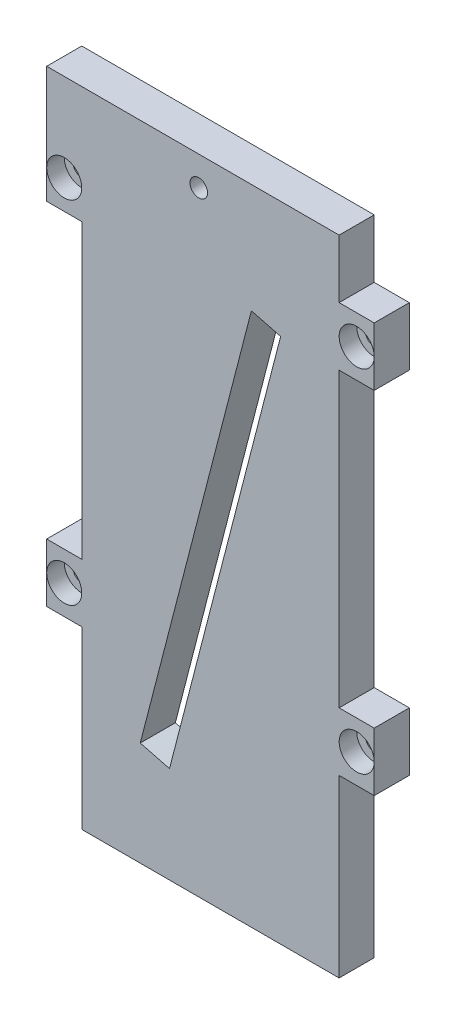
ISO-10303-21;
HEADER;
FILE_DESCRIPTION(('STEP AP214'),'2;1');
FILE_NAME('part.step','',(''),(''),'','','');
FILE_SCHEMA(('AUTOMOTIVE_DESIGN { 1 0 10303 214 1 1 1 1 }'));
ENDSEC;
DATA;
#1=APPLICATION_CONTEXT('core data for automotive mechanical design processes');
#2=APPLICATION_PROTOCOL_DEFINITION('international standard','automotive_design',2000,#1);
#3=PRODUCT_CONTEXT('',#1,'mechanical');
#4=PRODUCT('Part','Part','',(#3));
#5=PRODUCT_RELATED_PRODUCT_CATEGORY('part','',(#4));
#6=PRODUCT_DEFINITION_FORMATION('','',#4);
#7=PRODUCT_DEFINITION_CONTEXT('part definition',#1,'design');
#8=PRODUCT_DEFINITION('design','',#6,#7);
#9=PRODUCT_DEFINITION_SHAPE('','',#8);
#10=(LENGTH_UNIT() NAMED_UNIT(*) SI_UNIT(.MILLI.,.METRE.));
#11=(NAMED_UNIT(*) PLANE_ANGLE_UNIT() SI_UNIT($,.RADIAN.));
#12=(NAMED_UNIT(*) SI_UNIT($,.STERADIAN.) SOLID_ANGLE_UNIT());
#13=UNCERTAINTY_MEASURE_WITH_UNIT(LENGTH_MEASURE(1.E-05),#10,'distance_accuracy_value','');
#14=(GEOMETRIC_REPRESENTATION_CONTEXT(3) GLOBAL_UNCERTAINTY_ASSIGNED_CONTEXT((#13)) GLOBAL_UNIT_ASSIGNED_CONTEXT((#10,
#11,#12)) REPRESENTATION_CONTEXT('',''));
#15=CARTESIAN_POINT('',(0.,0.,0.));
#16=DIRECTION('',(0.,0.,1.));
#17=DIRECTION('',(1.,0.,0.));
#18=AXIS2_PLACEMENT_3D('',#15,#16,#17);
#19=CARTESIAN_POINT('',(-3.,75.,0.));
#20=DIRECTION('',(0.,0.,1.));
#21=DIRECTION('',(1.,0.,0.));
#22=AXIS2_PLACEMENT_3D('',#19,#20,#21);
#23=CYLINDRICAL_SURFACE('',#22,1.5);
#24=CARTESIAN_POINT('',(-3.,75.,0.));
#25=DIRECTION('',(0.,0.,1.));
#26=DIRECTION('',(1.,0.,0.));
#27=AXIS2_PLACEMENT_3D('',#24,#25,#26);
#28=CIRCLE('',#27,1.5);
#29=CARTESIAN_POINT('',(-1.5,75.,0.));
#30=VERTEX_POINT('',#29);
#31=EDGE_CURVE('E321',#30,#30,#28,.T.);
#32=ORIENTED_EDGE('',*,*,#31,.F.);
#33=EDGE_LOOP('',(#32));
#34=FACE_BOUND('',#33,.T.);
#35=CARTESIAN_POINT('',(-3.,75.,3.));
#36=DIRECTION('',(0.,0.,1.));
#37=DIRECTION('',(1.,0.,0.));
#38=AXIS2_PLACEMENT_3D('',#35,#36,#37);
#39=CIRCLE('',#38,1.5);
#40=CARTESIAN_POINT('',(-1.5,75.,3.));
#41=VERTEX_POINT('',#40);
#42=EDGE_CURVE('E301',#41,#41,#39,.F.);
#43=ORIENTED_EDGE('',*,*,#42,.F.);
#44=EDGE_LOOP('',(#43));
#45=FACE_BOUND('',#44,.T.);
#46=ADVANCED_FACE('F33',(#34,#45),#23,.F.);
#47=CARTESIAN_POINT('',(-3.,15.,0.));
#48=DIRECTION('',(0.,0.,1.));
#49=DIRECTION('',(1.,0.,0.));
#50=AXIS2_PLACEMENT_3D('',#47,#48,#49);
#51=CYLINDRICAL_SURFACE('',#50,1.5);
#52=CARTESIAN_POINT('',(-3.,15.,0.));
#53=DIRECTION('',(0.,0.,1.));
#54=DIRECTION('',(1.,0.,0.));
#55=AXIS2_PLACEMENT_3D('',#52,#53,#54);
#56=CIRCLE('',#55,1.5);
#57=CARTESIAN_POINT('',(-1.5,15.,0.));
#58=VERTEX_POINT('',#57);
#59=EDGE_CURVE('E318',#58,#58,#56,.T.);
#60=ORIENTED_EDGE('',*,*,#59,.F.);
#61=EDGE_LOOP('',(#60));
#62=FACE_BOUND('',#61,.T.);
#63=CARTESIAN_POINT('',(-3.,15.,3.));
#64=DIRECTION('',(0.,0.,1.));
#65=DIRECTION('',(1.,0.,0.));
#66=AXIS2_PLACEMENT_3D('',#63,#64,#65);
#67=CIRCLE('',#66,1.5);
#68=CARTESIAN_POINT('',(-1.5,15.,3.));
#69=VERTEX_POINT('',#68);
#70=EDGE_CURVE('E308',#69,#69,#67,.F.);
#71=ORIENTED_EDGE('',*,*,#70,.F.);
#72=EDGE_LOOP('',(#71));
#73=FACE_BOUND('',#72,.T.);
#74=ADVANCED_FACE('F471',(#62,#73),#51,.F.);
#75=CARTESIAN_POINT('',(0.,0.,6.));
#76=DIRECTION('',(1.,0.,0.));
#77=DIRECTION('',(0.,0.,-1.));
#78=AXIS2_PLACEMENT_3D('',#75,#76,#77);
#79=PLANE('',#78);
#80=DIRECTION('',(0.,1.,0.));
#81=VECTOR('',#80,1.);
#82=CARTESIAN_POINT('',(0.,-13.,4.));
#83=LINE('',#82,#81);
#84=CARTESIAN_POINT('',(0.,-13.,4.));
#85=VERTEX_POINT('',#84);
#86=CARTESIAN_POINT('',(0.,-6.50000000000001,4.));
#87=VERTEX_POINT('',#86);
#88=EDGE_CURVE('E245',#85,#87,#83,.T.);
#89=ORIENTED_EDGE('',*,*,#88,.F.);
#90=DIRECTION('',(0.,0.,-1.));
#91=VECTOR('',#90,1.);
#92=CARTESIAN_POINT('',(0.,-13.,4.));
#93=LINE('',#92,#91);
#94=CARTESIAN_POINT('',(0.,-13.,0.));
#95=VERTEX_POINT('',#94);
#96=EDGE_CURVE('E265',#85,#95,#93,.T.);
#97=ORIENTED_EDGE('',*,*,#96,.T.);
#98=DIRECTION('',(0.,-1.,0.));
#99=VECTOR('',#98,1.);
#100=CARTESIAN_POINT('',(0.,0.,0.));
#101=LINE('',#100,#99);
#102=CARTESIAN_POINT('',(0.,-20.,0.));
#103=VERTEX_POINT('',#102);
#104=EDGE_CURVE('E328',#95,#103,#101,.T.);
#105=ORIENTED_EDGE('',*,*,#104,.T.);
#106=DIRECTION('',(0.,0.,-1.));
#107=VECTOR('',#106,1.);
#108=CARTESIAN_POINT('',(0.,-20.,6.));
#109=LINE('',#108,#107);
#110=CARTESIAN_POINT('',(0.,-20.,6.));
#111=VERTEX_POINT('',#110);
#112=EDGE_CURVE('E280',#111,#103,#109,.T.);
#113=ORIENTED_EDGE('',*,*,#112,.F.);
#114=DIRECTION('',(0.,-1.,0.));
#115=VECTOR('',#114,1.);
#116=CARTESIAN_POINT('',(0.,0.,6.));
#117=LINE('',#116,#115);
#118=CARTESIAN_POINT('',(0.,9.99999999999999,6.));
#119=VERTEX_POINT('',#118);
#120=EDGE_CURVE('E331',#119,#111,#117,.T.);
#121=ORIENTED_EDGE('',*,*,#120,.F.);
#122=DIRECTION('',(0.,0.,-1.));
#123=VECTOR('',#122,1.);
#124=CARTESIAN_POINT('',(0.,9.99999999999999,6.));
#125=LINE('',#124,#123);
#126=CARTESIAN_POINT('',(0.,9.99999999999999,0.));
#127=VERTEX_POINT('',#126);
#128=EDGE_CURVE('E366',#119,#127,#125,.T.);
#129=ORIENTED_EDGE('',*,*,#128,.T.);
#130=CARTESIAN_POINT('',(0.,-6.50000000000001,0.));
#131=VERTEX_POINT('',#130);
#132=EDGE_CURVE('E367',#127,#131,#101,.T.);
#133=ORIENTED_EDGE('',*,*,#132,.T.);
#134=DIRECTION('',(0.,0.,-1.));
#135=VECTOR('',#134,1.);
#136=CARTESIAN_POINT('',(0.,-6.50000000000001,4.));
#137=LINE('',#136,#135);
#138=EDGE_CURVE('E258',#87,#131,#137,.T.);
#139=ORIENTED_EDGE('',*,*,#138,.F.);
#140=EDGE_LOOP('',(#89,#97,#105,#113,#121,#129,#133,#139));
#141=FACE_BOUND('',#140,.T.);
#142=ADVANCED_FACE('F35',(#141),#79,.F.);
#143=CARTESIAN_POINT('',(44.,0.,6.));
#144=DIRECTION('',(-1.,0.,0.));
#145=DIRECTION('',(0.,0.,1.));
#146=AXIS2_PLACEMENT_3D('',#143,#144,#145);
#147=PLANE('',#146);
#148=DIRECTION('',(0.,1.,0.));
#149=VECTOR('',#148,1.);
#150=CARTESIAN_POINT('',(44.,0.,0.));
#151=LINE('',#150,#149);
#152=CARTESIAN_POINT('',(44.,-20.,0.));
#153=VERTEX_POINT('',#152);
#154=CARTESIAN_POINT('',(44.,10.,0.));
#155=VERTEX_POINT('',#154);
#156=EDGE_CURVE('E370',#153,#155,#151,.T.);
#157=ORIENTED_EDGE('',*,*,#156,.T.);
#158=DIRECTION('',(0.,0.,-1.));
#159=VECTOR('',#158,1.);
#160=CARTESIAN_POINT('',(44.,10.,6.));
#161=LINE('',#160,#159);
#162=CARTESIAN_POINT('',(44.,10.,6.));
#163=VERTEX_POINT('',#162);
#164=EDGE_CURVE('E11',#163,#155,#161,.T.);
#165=ORIENTED_EDGE('',*,*,#164,.F.);
#166=DIRECTION('',(0.,1.,0.));
#167=VECTOR('',#166,1.);
#168=CARTESIAN_POINT('',(44.,0.,6.));
#169=LINE('',#168,#167);
#170=CARTESIAN_POINT('',(44.,-20.,6.));
#171=VERTEX_POINT('',#170);
#172=EDGE_CURVE('E333',#171,#163,#169,.T.);
#173=ORIENTED_EDGE('',*,*,#172,.F.);
#174=DIRECTION('',(0.,0.,-1.));
#175=VECTOR('',#174,1.);
#176=CARTESIAN_POINT('',(44.,-20.,6.));
#177=LINE('',#176,#175);
#178=EDGE_CURVE('E277',#171,#153,#177,.T.);
#179=ORIENTED_EDGE('',*,*,#178,.T.);
#180=EDGE_LOOP('',(#157,#165,#173,#179));
#181=FACE_BOUND('',#180,.T.);
#182=ADVANCED_FACE('F552',(#181),#147,.F.);
#183=CARTESIAN_POINT('',(44.,10.,6.));
#184=DIRECTION('',(0.,1.,0.));
#185=DIRECTION('',(0.,0.,1.));
#186=AXIS2_PLACEMENT_3D('',#183,#184,#185);
#187=PLANE('',#186);
#188=DIRECTION('',(1.,0.,0.));
#189=VECTOR('',#188,1.);
#190=CARTESIAN_POINT('',(44.,10.,0.));
#191=LINE('',#190,#189);
#192=CARTESIAN_POINT('',(50.,10.,0.));
#193=VERTEX_POINT('',#192);
#194=EDGE_CURVE('E372',#155,#193,#191,.T.);
#195=ORIENTED_EDGE('',*,*,#194,.T.);
#196=DIRECTION('',(0.,0.,-1.));
#197=VECTOR('',#196,1.);
#198=CARTESIAN_POINT('',(50.,10.,6.));
#199=LINE('',#198,#197);
#200=CARTESIAN_POINT('',(50.,10.,6.));
#201=VERTEX_POINT('',#200);
#202=EDGE_CURVE('E42',#201,#193,#199,.T.);
#203=ORIENTED_EDGE('',*,*,#202,.F.);
#204=DIRECTION('',(1.,0.,0.));
#205=VECTOR('',#204,1.);
#206=CARTESIAN_POINT('',(44.,10.,6.));
#207=LINE('',#206,#205);
#208=EDGE_CURVE('E336',#163,#201,#207,.T.);
#209=ORIENTED_EDGE('',*,*,#208,.F.);
#210=ORIENTED_EDGE('',*,*,#164,.T.);
#211=EDGE_LOOP('',(#195,#203,#209,#210));
#212=FACE_BOUND('',#211,.T.);
#213=ADVANCED_FACE('F549',(#212),#187,.F.);
#214=CARTESIAN_POINT('',(50.,10.,6.));
#215=DIRECTION('',(-1.,0.,0.));
#216=DIRECTION('',(0.,0.,1.));
#217=AXIS2_PLACEMENT_3D('',#214,#215,#216);
#218=PLANE('',#217);
#219=DIRECTION('',(0.,1.,0.));
#220=VECTOR('',#219,1.);
#221=CARTESIAN_POINT('',(50.,10.,0.));
#222=LINE('',#221,#220);
#223=CARTESIAN_POINT('',(50.,20.,0.));
#224=VERTEX_POINT('',#223);
#225=EDGE_CURVE('E374',#193,#224,#222,.T.);
#226=ORIENTED_EDGE('',*,*,#225,.T.);
#227=DIRECTION('',(0.,0.,-1.));
#228=VECTOR('',#227,1.);
#229=CARTESIAN_POINT('',(50.,20.,6.));
#230=LINE('',#229,#228);
#231=CARTESIAN_POINT('',(50.,20.,6.));
#232=VERTEX_POINT('',#231);
#233=EDGE_CURVE('E439',#232,#224,#230,.T.);
#234=ORIENTED_EDGE('',*,*,#233,.F.);
#235=DIRECTION('',(0.,1.,0.));
#236=VECTOR('',#235,1.);
#237=CARTESIAN_POINT('',(50.,10.,6.));
#238=LINE('',#237,#236);
#239=EDGE_CURVE('E338',#201,#232,#238,.T.);
#240=ORIENTED_EDGE('',*,*,#239,.F.);
#241=ORIENTED_EDGE('',*,*,#202,.T.);
#242=EDGE_LOOP('',(#226,#234,#240,#241));
#243=FACE_BOUND('',#242,.T.);
#244=ADVANCED_FACE('F545',(#243),#218,.F.);
#245=CARTESIAN_POINT('',(44.,20.,6.));
#246=DIRECTION('',(0.,-1.,0.));
#247=DIRECTION('',(1.,0.,0.));
#248=AXIS2_PLACEMENT_3D('',#245,#246,#247);
#249=PLANE('',#248);
#250=DIRECTION('',(-1.,0.,0.));
#251=VECTOR('',#250,1.);
#252=CARTESIAN_POINT('',(44.,20.,0.));
#253=LINE('',#252,#251);
#254=CARTESIAN_POINT('',(44.,20.,0.));
#255=VERTEX_POINT('',#254);
#256=EDGE_CURVE('E376',#224,#255,#253,.T.);
#257=ORIENTED_EDGE('',*,*,#256,.T.);
#258=DIRECTION('',(0.,0.,-1.));
#259=VECTOR('',#258,1.);
#260=CARTESIAN_POINT('',(44.,20.,6.));
#261=LINE('',#260,#259);
#262=CARTESIAN_POINT('',(44.,20.,6.));
#263=VERTEX_POINT('',#262);
#264=EDGE_CURVE('E436',#263,#255,#261,.T.);
#265=ORIENTED_EDGE('',*,*,#264,.F.);
#266=DIRECTION('',(-1.,0.,0.));
#267=VECTOR('',#266,1.);
#268=CARTESIAN_POINT('',(44.,20.,6.));
#269=LINE('',#268,#267);
#270=EDGE_CURVE('E340',#232,#263,#269,.T.);
#271=ORIENTED_EDGE('',*,*,#270,.F.);
#272=ORIENTED_EDGE('',*,*,#233,.T.);
#273=EDGE_LOOP('',(#257,#265,#271,#272));
#274=FACE_BOUND('',#273,.T.);
#275=ADVANCED_FACE('F541',(#274),#249,.F.);
#276=CARTESIAN_POINT('',(44.,20.,6.));
#277=DIRECTION('',(-1.,0.,0.));
#278=DIRECTION('',(0.,-1.,0.));
#279=AXIS2_PLACEMENT_3D('',#276,#277,#278);
#280=PLANE('',#279);
#281=DIRECTION('',(0.,1.,0.));
#282=VECTOR('',#281,1.);
#283=CARTESIAN_POINT('',(44.,20.,0.));
#284=LINE('',#283,#282);
#285=CARTESIAN_POINT('',(44.,70.,0.));
#286=VERTEX_POINT('',#285);
#287=EDGE_CURVE('E378',#255,#286,#284,.T.);
#288=ORIENTED_EDGE('',*,*,#287,.T.);
#289=DIRECTION('',(0.,0.,-1.));
#290=VECTOR('',#289,1.);
#291=CARTESIAN_POINT('',(44.,70.,6.));
#292=LINE('',#291,#290);
#293=CARTESIAN_POINT('',(44.,70.,6.));
#294=VERTEX_POINT('',#293);
#295=EDGE_CURVE('E433',#294,#286,#292,.T.);
#296=ORIENTED_EDGE('',*,*,#295,.F.);
#297=DIRECTION('',(0.,1.,0.));
#298=VECTOR('',#297,1.);
#299=CARTESIAN_POINT('',(44.,20.,6.));
#300=LINE('',#299,#298);
#301=EDGE_CURVE('E342',#263,#294,#300,.T.);
#302=ORIENTED_EDGE('',*,*,#301,.F.);
#303=ORIENTED_EDGE('',*,*,#264,.T.);
#304=EDGE_LOOP('',(#288,#296,#302,#303));
#305=FACE_BOUND('',#304,.T.);
#306=ADVANCED_FACE('F537',(#305),#280,.F.);
#307=CARTESIAN_POINT('',(44.,70.,6.));
#308=DIRECTION('',(0.,1.,0.));
#309=DIRECTION('',(0.,0.,1.));
#310=AXIS2_PLACEMENT_3D('',#307,#308,#309);
#311=PLANE('',#310);
#312=DIRECTION('',(1.,0.,0.));
#313=VECTOR('',#312,1.);
#314=CARTESIAN_POINT('',(44.,70.,0.));
#315=LINE('',#314,#313);
#316=CARTESIAN_POINT('',(50.,70.,0.));
#317=VERTEX_POINT('',#316);
#318=EDGE_CURVE('E380',#286,#317,#315,.T.);
#319=ORIENTED_EDGE('',*,*,#318,.T.);
#320=DIRECTION('',(0.,0.,-1.));
#321=VECTOR('',#320,1.);
#322=CARTESIAN_POINT('',(50.,70.,6.));
#323=LINE('',#322,#321);
#324=CARTESIAN_POINT('',(50.,70.,6.));
#325=VERTEX_POINT('',#324);
#326=EDGE_CURVE('E430',#325,#317,#323,.T.);
#327=ORIENTED_EDGE('',*,*,#326,.F.);
#328=DIRECTION('',(1.,0.,0.));
#329=VECTOR('',#328,1.);
#330=CARTESIAN_POINT('',(44.,70.,6.));
#331=LINE('',#330,#329);
#332=EDGE_CURVE('E344',#294,#325,#331,.T.);
#333=ORIENTED_EDGE('',*,*,#332,.F.);
#334=ORIENTED_EDGE('',*,*,#295,.T.);
#335=EDGE_LOOP('',(#319,#327,#333,#334));
#336=FACE_BOUND('',#335,.T.);
#337=ADVANCED_FACE('F533',(#336),#311,.F.);
#338=CARTESIAN_POINT('',(50.,80.,6.));
#339=DIRECTION('',(-1.,0.,0.));
#340=DIRECTION('',(0.,0.,1.));
#341=AXIS2_PLACEMENT_3D('',#338,#339,#340);
#342=PLANE('',#341);
#343=DIRECTION('',(0.,1.,0.));
#344=VECTOR('',#343,1.);
#345=CARTESIAN_POINT('',(50.,80.,0.));
#346=LINE('',#345,#344);
#347=CARTESIAN_POINT('',(50.,80.,0.));
#348=VERTEX_POINT('',#347);
#349=EDGE_CURVE('E382',#317,#348,#346,.T.);
#350=ORIENTED_EDGE('',*,*,#349,.T.);
#351=DIRECTION('',(0.,0.,-1.));
#352=VECTOR('',#351,1.);
#353=CARTESIAN_POINT('',(50.,80.,6.));
#354=LINE('',#353,#352);
#355=CARTESIAN_POINT('',(50.,80.,6.));
#356=VERTEX_POINT('',#355);
#357=EDGE_CURVE('E427',#356,#348,#354,.T.);
#358=ORIENTED_EDGE('',*,*,#357,.F.);
#359=DIRECTION('',(0.,1.,0.));
#360=VECTOR('',#359,1.);
#361=CARTESIAN_POINT('',(50.,80.,6.));
#362=LINE('',#361,#360);
#363=EDGE_CURVE('E346',#325,#356,#362,.T.);
#364=ORIENTED_EDGE('',*,*,#363,.F.);
#365=ORIENTED_EDGE('',*,*,#326,.T.);
#366=EDGE_LOOP('',(#350,#358,#364,#365));
#367=FACE_BOUND('',#366,.T.);
#368=ADVANCED_FACE('F529',(#367),#342,.F.);
#369=CARTESIAN_POINT('',(44.,80.,6.));
#370=DIRECTION('',(0.,-1.,0.));
#371=DIRECTION('',(0.,0.,-1.));
#372=AXIS2_PLACEMENT_3D('',#369,#370,#371);
#373=PLANE('',#372);
#374=DIRECTION('',(-1.,0.,0.));
#375=VECTOR('',#374,1.);
#376=CARTESIAN_POINT('',(44.,80.,0.));
#377=LINE('',#376,#375);
#378=CARTESIAN_POINT('',(44.,80.,0.));
#379=VERTEX_POINT('',#378);
#380=EDGE_CURVE('E384',#348,#379,#377,.T.);
#381=ORIENTED_EDGE('',*,*,#380,.T.);
#382=DIRECTION('',(0.,0.,-1.));
#383=VECTOR('',#382,1.);
#384=CARTESIAN_POINT('',(44.,80.,6.));
#385=LINE('',#384,#383);
#386=CARTESIAN_POINT('',(44.,80.,6.));
#387=VERTEX_POINT('',#386);
#388=EDGE_CURVE('E424',#387,#379,#385,.T.);
#389=ORIENTED_EDGE('',*,*,#388,.F.);
#390=DIRECTION('',(-1.,0.,0.));
#391=VECTOR('',#390,1.);
#392=CARTESIAN_POINT('',(44.,80.,6.));
#393=LINE('',#392,#391);
#394=EDGE_CURVE('E348',#356,#387,#393,.T.);
#395=ORIENTED_EDGE('',*,*,#394,.F.);
#396=ORIENTED_EDGE('',*,*,#357,.T.);
#397=EDGE_LOOP('',(#381,#389,#395,#396));
#398=FACE_BOUND('',#397,.T.);
#399=ADVANCED_FACE('F525',(#398),#373,.F.);
#400=CARTESIAN_POINT('',(44.,80.,6.));
#401=DIRECTION('',(-1.,0.,0.));
#402=DIRECTION('',(0.,-1.,0.));
#403=AXIS2_PLACEMENT_3D('',#400,#401,#402);
#404=PLANE('',#403);
#405=DIRECTION('',(0.,1.,0.));
#406=VECTOR('',#405,1.);
#407=CARTESIAN_POINT('',(44.,80.,0.));
#408=LINE('',#407,#406);
#409=CARTESIAN_POINT('',(44.,90.,0.));
#410=VERTEX_POINT('',#409);
#411=EDGE_CURVE('E386',#379,#410,#408,.T.);
#412=ORIENTED_EDGE('',*,*,#411,.T.);
#413=DIRECTION('',(0.,0.,-1.));
#414=VECTOR('',#413,1.);
#415=CARTESIAN_POINT('',(44.,90.,6.));
#416=LINE('',#415,#414);
#417=CARTESIAN_POINT('',(44.,90.,6.));
#418=VERTEX_POINT('',#417);
#419=EDGE_CURVE('E421',#418,#410,#416,.T.);
#420=ORIENTED_EDGE('',*,*,#419,.F.);
#421=DIRECTION('',(0.,1.,0.));
#422=VECTOR('',#421,1.);
#423=CARTESIAN_POINT('',(44.,80.,6.));
#424=LINE('',#423,#422);
#425=EDGE_CURVE('E350',#387,#418,#424,.T.);
#426=ORIENTED_EDGE('',*,*,#425,.F.);
#427=ORIENTED_EDGE('',*,*,#388,.T.);
#428=EDGE_LOOP('',(#412,#420,#426,#427));
#429=FACE_BOUND('',#428,.T.);
#430=ADVANCED_FACE('F521',(#429),#404,.F.);
#431=CARTESIAN_POINT('',(-6.,90.,6.));
#432=DIRECTION('',(0.,-1.,0.));
#433=DIRECTION('',(0.,0.,-1.));
#434=AXIS2_PLACEMENT_3D('',#431,#432,#433);
#435=PLANE('',#434);
#436=DIRECTION('',(-1.,0.,0.));
#437=VECTOR('',#436,1.);
#438=CARTESIAN_POINT('',(-6.,90.,0.));
#439=LINE('',#438,#437);
#440=CARTESIAN_POINT('',(-6.,90.,0.));
#441=VERTEX_POINT('',#440);
#442=EDGE_CURVE('E388',#410,#441,#439,.T.);
#443=ORIENTED_EDGE('',*,*,#442,.T.);
#444=DIRECTION('',(0.,0.,-1.));
#445=VECTOR('',#444,1.);
#446=CARTESIAN_POINT('',(-6.,90.,6.));
#447=LINE('',#446,#445);
#448=CARTESIAN_POINT('',(-6.,90.,6.));
#449=VERTEX_POINT('',#448);
#450=EDGE_CURVE('E418',#449,#441,#447,.T.);
#451=ORIENTED_EDGE('',*,*,#450,.F.);
#452=DIRECTION('',(-1.,0.,0.));
#453=VECTOR('',#452,1.);
#454=CARTESIAN_POINT('',(-6.,90.,6.));
#455=LINE('',#454,#453);
#456=EDGE_CURVE('E352',#418,#449,#455,.T.);
#457=ORIENTED_EDGE('',*,*,#456,.F.);
#458=ORIENTED_EDGE('',*,*,#419,.T.);
#459=EDGE_LOOP('',(#443,#451,#457,#458));
#460=FACE_BOUND('',#459,.T.);
#461=ADVANCED_FACE('F517',(#460),#435,.F.);
#462=CARTESIAN_POINT('',(-6.,70.,6.));
#463=DIRECTION('',(1.,0.,0.));
#464=DIRECTION('',(0.,0.,-1.));
#465=AXIS2_PLACEMENT_3D('',#462,#463,#464);
#466=PLANE('',#465);
#467=DIRECTION('',(0.,-1.,0.));
#468=VECTOR('',#467,1.);
#469=CARTESIAN_POINT('',(-6.,70.,0.));
#470=LINE('',#469,#468);
#471=CARTESIAN_POINT('',(-6.,70.,0.));
#472=VERTEX_POINT('',#471);
#473=EDGE_CURVE('E390',#441,#472,#470,.T.);
#474=ORIENTED_EDGE('',*,*,#473,.T.);
#475=DIRECTION('',(0.,0.,-1.));
#476=VECTOR('',#475,1.);
#477=CARTESIAN_POINT('',(-6.,70.,6.));
#478=LINE('',#477,#476);
#479=CARTESIAN_POINT('',(-6.,70.,6.));
#480=VERTEX_POINT('',#479);
#481=EDGE_CURVE('E415',#480,#472,#478,.T.);
#482=ORIENTED_EDGE('',*,*,#481,.F.);
#483=DIRECTION('',(0.,-1.,0.));
#484=VECTOR('',#483,1.);
#485=CARTESIAN_POINT('',(-6.,70.,6.));
#486=LINE('',#485,#484);
#487=EDGE_CURVE('E354',#449,#480,#486,.T.);
#488=ORIENTED_EDGE('',*,*,#487,.F.);
#489=ORIENTED_EDGE('',*,*,#450,.T.);
#490=EDGE_LOOP('',(#474,#482,#488,#489));
#491=FACE_BOUND('',#490,.T.);
#492=ADVANCED_FACE('F513',(#491),#466,.F.);
#493=CARTESIAN_POINT('',(0.,70.,6.));
#494=DIRECTION('',(0.,1.,0.));
#495=DIRECTION('',(0.,0.,1.));
#496=AXIS2_PLACEMENT_3D('',#493,#494,#495);
#497=PLANE('',#496);
#498=DIRECTION('',(1.,0.,0.));
#499=VECTOR('',#498,1.);
#500=CARTESIAN_POINT('',(0.,70.,0.));
#501=LINE('',#500,#499);
#502=CARTESIAN_POINT('',(0.,70.,0.));
#503=VERTEX_POINT('',#502);
#504=EDGE_CURVE('E392',#472,#503,#501,.T.);
#505=ORIENTED_EDGE('',*,*,#504,.T.);
#506=DIRECTION('',(0.,0.,-1.));
#507=VECTOR('',#506,1.);
#508=CARTESIAN_POINT('',(0.,70.,6.));
#509=LINE('',#508,#507);
#510=CARTESIAN_POINT('',(0.,70.,6.));
#511=VERTEX_POINT('',#510);
#512=EDGE_CURVE('E412',#511,#503,#509,.T.);
#513=ORIENTED_EDGE('',*,*,#512,.F.);
#514=DIRECTION('',(1.,0.,0.));
#515=VECTOR('',#514,1.);
#516=CARTESIAN_POINT('',(0.,70.,6.));
#517=LINE('',#516,#515);
#518=EDGE_CURVE('E356',#480,#511,#517,.T.);
#519=ORIENTED_EDGE('',*,*,#518,.F.);
#520=ORIENTED_EDGE('',*,*,#481,.T.);
#521=EDGE_LOOP('',(#505,#513,#519,#520));
#522=FACE_BOUND('',#521,.T.);
#523=ADVANCED_FACE('F509',(#522),#497,.F.);
#524=CARTESIAN_POINT('',(0.,20.,6.));
#525=DIRECTION('',(1.,0.,0.));
#526=DIRECTION('',(0.,1.,0.));
#527=AXIS2_PLACEMENT_3D('',#524,#525,#526);
#528=PLANE('',#527);
#529=DIRECTION('',(0.,-1.,0.));
#530=VECTOR('',#529,1.);
#531=CARTESIAN_POINT('',(0.,20.,0.));
#532=LINE('',#531,#530);
#533=CARTESIAN_POINT('',(0.,20.,0.));
#534=VERTEX_POINT('',#533);
#535=EDGE_CURVE('E394',#503,#534,#532,.T.);
#536=ORIENTED_EDGE('',*,*,#535,.T.);
#537=DIRECTION('',(0.,0.,-1.));
#538=VECTOR('',#537,1.);
#539=CARTESIAN_POINT('',(0.,20.,6.));
#540=LINE('',#539,#538);
#541=CARTESIAN_POINT('',(0.,20.,6.));
#542=VERTEX_POINT('',#541);
#543=EDGE_CURVE('E409',#542,#534,#540,.T.);
#544=ORIENTED_EDGE('',*,*,#543,.F.);
#545=DIRECTION('',(0.,-1.,0.));
#546=VECTOR('',#545,1.);
#547=CARTESIAN_POINT('',(0.,20.,6.));
#548=LINE('',#547,#546);
#549=EDGE_CURVE('E358',#511,#542,#548,.T.);
#550=ORIENTED_EDGE('',*,*,#549,.F.);
#551=ORIENTED_EDGE('',*,*,#512,.T.);
#552=EDGE_LOOP('',(#536,#544,#550,#551));
#553=FACE_BOUND('',#552,.T.);
#554=ADVANCED_FACE('F505',(#553),#528,.F.);
#555=CARTESIAN_POINT('',(0.,20.,6.));
#556=DIRECTION('',(0.,-1.,0.));
#557=DIRECTION('',(0.,0.,-1.));
#558=AXIS2_PLACEMENT_3D('',#555,#556,#557);
#559=PLANE('',#558);
#560=DIRECTION('',(-1.,0.,0.));
#561=VECTOR('',#560,1.);
#562=CARTESIAN_POINT('',(0.,20.,0.));
#563=LINE('',#562,#561);
#564=CARTESIAN_POINT('',(-6.,20.,0.));
#565=VERTEX_POINT('',#564);
#566=EDGE_CURVE('E396',#534,#565,#563,.T.);
#567=ORIENTED_EDGE('',*,*,#566,.T.);
#568=DIRECTION('',(0.,0.,-1.));
#569=VECTOR('',#568,1.);
#570=CARTESIAN_POINT('',(-6.,20.,6.));
#571=LINE('',#570,#569);
#572=CARTESIAN_POINT('',(-6.,20.,6.));
#573=VERTEX_POINT('',#572);
#574=EDGE_CURVE('E406',#573,#565,#571,.T.);
#575=ORIENTED_EDGE('',*,*,#574,.F.);
#576=DIRECTION('',(-1.,0.,0.));
#577=VECTOR('',#576,1.);
#578=CARTESIAN_POINT('',(0.,20.,6.));
#579=LINE('',#578,#577);
#580=EDGE_CURVE('E360',#542,#573,#579,.T.);
#581=ORIENTED_EDGE('',*,*,#580,.F.);
#582=ORIENTED_EDGE('',*,*,#543,.T.);
#583=EDGE_LOOP('',(#567,#575,#581,#582));
#584=FACE_BOUND('',#583,.T.);
#585=ADVANCED_FACE('F501',(#584),#559,.F.);
#586=CARTESIAN_POINT('',(-6.,9.99999999999999,6.));
#587=DIRECTION('',(1.,0.,0.));
#588=DIRECTION('',(0.,0.,-1.));
#589=AXIS2_PLACEMENT_3D('',#586,#587,#588);
#590=PLANE('',#589);
#591=DIRECTION('',(0.,-1.,0.));
#592=VECTOR('',#591,1.);
#593=CARTESIAN_POINT('',(-6.,9.99999999999999,0.));
#594=LINE('',#593,#592);
#595=CARTESIAN_POINT('',(-6.,9.99999999999999,0.));
#596=VERTEX_POINT('',#595);
#597=EDGE_CURVE('E398',#565,#596,#594,.T.);
#598=ORIENTED_EDGE('',*,*,#597,.T.);
#599=DIRECTION('',(0.,0.,-1.));
#600=VECTOR('',#599,1.);
#601=CARTESIAN_POINT('',(-6.,9.99999999999999,6.));
#602=LINE('',#601,#600);
#603=CARTESIAN_POINT('',(-6.,9.99999999999999,6.));
#604=VERTEX_POINT('',#603);
#605=EDGE_CURVE('E403',#604,#596,#602,.T.);
#606=ORIENTED_EDGE('',*,*,#605,.F.);
#607=DIRECTION('',(0.,-1.,0.));
#608=VECTOR('',#607,1.);
#609=CARTESIAN_POINT('',(-6.,9.99999999999999,6.));
#610=LINE('',#609,#608);
#611=EDGE_CURVE('E362',#573,#604,#610,.T.);
#612=ORIENTED_EDGE('',*,*,#611,.F.);
#613=ORIENTED_EDGE('',*,*,#574,.T.);
#614=EDGE_LOOP('',(#598,#606,#612,#613));
#615=FACE_BOUND('',#614,.T.);
#616=ADVANCED_FACE('F497',(#615),#590,.F.);
#617=CARTESIAN_POINT('',(0.,9.99999999999999,6.));
#618=DIRECTION('',(0.,1.,0.));
#619=DIRECTION('',(0.,0.,1.));
#620=AXIS2_PLACEMENT_3D('',#617,#618,#619);
#621=PLANE('',#620);
#622=DIRECTION('',(1.,0.,0.));
#623=VECTOR('',#622,1.);
#624=CARTESIAN_POINT('',(0.,9.99999999999999,0.));
#625=LINE('',#624,#623);
#626=EDGE_CURVE('E334',#596,#127,#625,.T.);
#627=ORIENTED_EDGE('',*,*,#626,.T.);
#628=ORIENTED_EDGE('',*,*,#128,.F.);
#629=DIRECTION('',(1.,0.,0.));
#630=VECTOR('',#629,1.);
#631=CARTESIAN_POINT('',(0.,9.99999999999999,6.));
#632=LINE('',#631,#630);
#633=EDGE_CURVE('E364',#604,#119,#632,.T.);
#634=ORIENTED_EDGE('',*,*,#633,.F.);
#635=ORIENTED_EDGE('',*,*,#605,.T.);
#636=EDGE_LOOP('',(#627,#628,#634,#635));
#637=FACE_BOUND('',#636,.T.);
#638=ADVANCED_FACE('F491',(#637),#621,.F.);
#639=CARTESIAN_POINT('',(0.,0.,6.));
#640=DIRECTION('',(0.,0.,1.));
#641=DIRECTION('',(1.,0.,0.));
#642=AXIS2_PLACEMENT_3D('',#639,#640,#641);
#643=PLANE('',#642);
#644=DIRECTION('',(0.968174432456168,-0.250276383900233,0.));
#645=VECTOR('',#644,1.);
#646=CARTESIAN_POINT('',(29.,71.2925170068027,6.));
#647=LINE('',#646,#645);
#648=CARTESIAN_POINT('',(29.,71.2925170068027,6.));
#649=VERTEX_POINT('',#648);
#650=CARTESIAN_POINT('',(34.,70.,6.));
#651=VERTEX_POINT('',#650);
#652=EDGE_CURVE('E210',#649,#651,#647,.T.);
#653=ORIENTED_EDGE('',*,*,#652,.T.);
#654=DIRECTION('',(-0.250276383900234,-0.968174432456168,0.));
#655=VECTOR('',#654,1.);
#656=CARTESIAN_POINT('',(34.,70.,6.));
#657=LINE('',#656,#655);
#658=CARTESIAN_POINT('',(15.,-3.50000000000001,6.));
#659=VERTEX_POINT('',#658);
#660=EDGE_CURVE('E219',#651,#659,#657,.T.);
#661=ORIENTED_EDGE('',*,*,#660,.T.);
#662=DIRECTION('',(-0.968174432456168,0.250276383900234,0.));
#663=VECTOR('',#662,1.);
#664=CARTESIAN_POINT('',(15.,-3.50000000000001,6.));
#665=LINE('',#664,#663);
#666=CARTESIAN_POINT('',(10.,-2.20748299319729,6.));
#667=VERTEX_POINT('',#666);
#668=EDGE_CURVE('E50',#659,#667,#665,.T.);
#669=ORIENTED_EDGE('',*,*,#668,.T.);
#670=DIRECTION('',(0.250276383900234,0.968174432456168,0.));
#671=VECTOR('',#670,1.);
#672=CARTESIAN_POINT('',(10.,-2.20748299319729,6.));
#673=LINE('',#672,#671);
#674=EDGE_CURVE('E216',#667,#649,#673,.T.);
#675=ORIENTED_EDGE('',*,*,#674,.T.);
#676=EDGE_LOOP('',(#653,#661,#669,#675));
#677=FACE_BOUND('',#676,.T.);
#678=CARTESIAN_POINT('',(47.,15.,6.));
#679=DIRECTION('',(0.,0.,1.));
#680=DIRECTION('',(-1.,0.,0.));
#681=AXIS2_PLACEMENT_3D('',#678,#679,#680);
#682=CIRCLE('',#681,2.995);
#683=CARTESIAN_POINT('',(44.005,15.,6.));
#684=VERTEX_POINT('',#683);
#685=EDGE_CURVE('E283',#684,#684,#682,.T.);
#686=ORIENTED_EDGE('',*,*,#685,.F.);
#687=EDGE_LOOP('',(#686));
#688=FACE_BOUND('',#687,.T.);
#689=CARTESIAN_POINT('',(47.,75.,6.));
#690=DIRECTION('',(0.,0.,1.));
#691=DIRECTION('',(-1.,0.,0.));
#692=AXIS2_PLACEMENT_3D('',#689,#690,#691);
#693=CIRCLE('',#692,2.99499999999999);
#694=CARTESIAN_POINT('',(44.005,75.,6.));
#695=VERTEX_POINT('',#694);
#696=EDGE_CURVE('E295',#695,#695,#693,.T.);
#697=ORIENTED_EDGE('',*,*,#696,.F.);
#698=EDGE_LOOP('',(#697));
#699=FACE_BOUND('',#698,.T.);
#700=CARTESIAN_POINT('',(-3.,75.,6.));
#701=DIRECTION('',(0.,0.,1.));
#702=DIRECTION('',(1.,0.,0.));
#703=AXIS2_PLACEMENT_3D('',#700,#701,#702);
#704=CIRCLE('',#703,2.995);
#705=CARTESIAN_POINT('',(-0.00500000000000153,75.,6.));
#706=VERTEX_POINT('',#705);
#707=EDGE_CURVE('E302',#706,#706,#704,.T.);
#708=ORIENTED_EDGE('',*,*,#707,.F.);
#709=EDGE_LOOP('',(#708));
#710=FACE_BOUND('',#709,.T.);
#711=CARTESIAN_POINT('',(-3.,15.,6.));
#712=DIRECTION('',(0.,0.,1.));
#713=DIRECTION('',(1.,0.,0.));
#714=AXIS2_PLACEMENT_3D('',#711,#712,#713);
#715=CIRCLE('',#714,2.995);
#716=CARTESIAN_POINT('',(-0.0049999999999985,15.,6.));
#717=VERTEX_POINT('',#716);
#718=EDGE_CURVE('E309',#717,#717,#715,.T.);
#719=ORIENTED_EDGE('',*,*,#718,.F.);
#720=EDGE_LOOP('',(#719));
#721=FACE_BOUND('',#720,.T.);
#722=CARTESIAN_POINT('',(20.,85.,6.));
#723=DIRECTION('',(0.,0.,1.));
#724=DIRECTION('',(1.,0.,0.));
#725=AXIS2_PLACEMENT_3D('',#722,#723,#724);
#726=CIRCLE('',#725,1.5);
#727=CARTESIAN_POINT('',(21.5,85.,6.));
#728=VERTEX_POINT('',#727);
#729=EDGE_CURVE('E324',#728,#728,#726,.T.);
#730=ORIENTED_EDGE('',*,*,#729,.F.);
#731=EDGE_LOOP('',(#730));
#732=FACE_BOUND('',#731,.T.);
#733=ORIENTED_EDGE('',*,*,#120,.T.);
#734=DIRECTION('',(-1.,0.,0.));
#735=VECTOR('',#734,1.);
#736=CARTESIAN_POINT('',(0.,-20.,6.));
#737=LINE('',#736,#735);
#738=EDGE_CURVE('E274',#171,#111,#737,.T.);
#739=ORIENTED_EDGE('',*,*,#738,.F.);
#740=ORIENTED_EDGE('',*,*,#172,.T.);
#741=ORIENTED_EDGE('',*,*,#208,.T.);
#742=ORIENTED_EDGE('',*,*,#239,.T.);
#743=ORIENTED_EDGE('',*,*,#270,.T.);
#744=ORIENTED_EDGE('',*,*,#301,.T.);
#745=ORIENTED_EDGE('',*,*,#332,.T.);
#746=ORIENTED_EDGE('',*,*,#363,.T.);
#747=ORIENTED_EDGE('',*,*,#394,.T.);
#748=ORIENTED_EDGE('',*,*,#425,.T.);
#749=ORIENTED_EDGE('',*,*,#456,.T.);
#750=ORIENTED_EDGE('',*,*,#487,.T.);
#751=ORIENTED_EDGE('',*,*,#518,.T.);
#752=ORIENTED_EDGE('',*,*,#549,.T.);
#753=ORIENTED_EDGE('',*,*,#580,.T.);
#754=ORIENTED_EDGE('',*,*,#611,.T.);
#755=ORIENTED_EDGE('',*,*,#633,.T.);
#756=EDGE_LOOP('',(#733,#739,#740,#741,#742,#743,#744,#745,#746,#747,#748,#749,#750,#751,#752,
#753,#754,#755));
#757=FACE_BOUND('',#756,.T.);
#758=ADVANCED_FACE('F223',(#677,#688,#699,#710,#721,#732,#757),#643,.T.);
#759=CARTESIAN_POINT('',(0.,0.,0.));
#760=DIRECTION('',(0.,0.,1.));
#761=DIRECTION('',(1.,0.,0.));
#762=AXIS2_PLACEMENT_3D('',#759,#760,#761);
#763=PLANE('',#762);
#764=DIRECTION('',(-0.250276383900234,-0.968174432456168,0.));
#765=VECTOR('',#764,1.);
#766=CARTESIAN_POINT('',(34.,70.,0.));
#767=LINE('',#766,#765);
#768=CARTESIAN_POINT('',(34.,70.,0.));
#769=VERTEX_POINT('',#768);
#770=CARTESIAN_POINT('',(15.,-3.50000000000001,0.));
#771=VERTEX_POINT('',#770);
#772=EDGE_CURVE('E235',#769,#771,#767,.T.);
#773=ORIENTED_EDGE('',*,*,#772,.F.);
#774=DIRECTION('',(0.968174432456168,-0.250276383900233,0.));
#775=VECTOR('',#774,1.);
#776=CARTESIAN_POINT('',(29.,71.2925170068027,0.));
#777=LINE('',#776,#775);
#778=CARTESIAN_POINT('',(29.,71.2925170068027,0.));
#779=VERTEX_POINT('',#778);
#780=EDGE_CURVE('E58',#779,#769,#777,.T.);
#781=ORIENTED_EDGE('',*,*,#780,.F.);
#782=DIRECTION('',(0.250276383900234,0.968174432456168,0.));
#783=VECTOR('',#782,1.);
#784=CARTESIAN_POINT('',(10.,-2.20748299319729,0.));
#785=LINE('',#784,#783);
#786=CARTESIAN_POINT('',(10.,-2.20748299319729,0.));
#787=VERTEX_POINT('',#786);
#788=EDGE_CURVE('E226',#787,#779,#785,.T.);
#789=ORIENTED_EDGE('',*,*,#788,.F.);
#790=DIRECTION('',(-0.968174432456168,0.250276383900234,0.));
#791=VECTOR('',#790,1.);
#792=CARTESIAN_POINT('',(15.,-3.50000000000001,0.));
#793=LINE('',#792,#791);
#794=EDGE_CURVE('E229',#771,#787,#793,.T.);
#795=ORIENTED_EDGE('',*,*,#794,.F.);
#796=EDGE_LOOP('',(#773,#781,#789,#795));
#797=FACE_BOUND('',#796,.T.);
#798=CARTESIAN_POINT('',(47.,75.,0.));
#799=DIRECTION('',(0.,0.,1.));
#800=DIRECTION('',(-1.,0.,0.));
#801=AXIS2_PLACEMENT_3D('',#798,#799,#800);
#802=CIRCLE('',#801,1.5);
#803=CARTESIAN_POINT('',(45.5,75.,0.));
#804=VERTEX_POINT('',#803);
#805=EDGE_CURVE('E312',#804,#804,#802,.T.);
#806=ORIENTED_EDGE('',*,*,#805,.T.);
#807=EDGE_LOOP('',(#806));
#808=FACE_BOUND('',#807,.T.);
#809=CARTESIAN_POINT('',(47.,15.,0.));
#810=DIRECTION('',(0.,0.,1.));
#811=DIRECTION('',(-1.,0.,0.));
#812=AXIS2_PLACEMENT_3D('',#809,#810,#811);
#813=CIRCLE('',#812,1.5);
#814=CARTESIAN_POINT('',(45.5,15.,0.));
#815=VERTEX_POINT('',#814);
#816=EDGE_CURVE('E315',#815,#815,#813,.T.);
#817=ORIENTED_EDGE('',*,*,#816,.T.);
#818=EDGE_LOOP('',(#817));
#819=FACE_BOUND('',#818,.T.);
#820=ORIENTED_EDGE('',*,*,#59,.T.);
#821=EDGE_LOOP('',(#820));
#822=FACE_BOUND('',#821,.T.);
#823=ORIENTED_EDGE('',*,*,#31,.T.);
#824=EDGE_LOOP('',(#823));
#825=FACE_BOUND('',#824,.T.);
#826=CARTESIAN_POINT('',(20.,85.,0.));
#827=DIRECTION('',(0.,0.,1.));
#828=DIRECTION('',(1.,0.,0.));
#829=AXIS2_PLACEMENT_3D('',#826,#827,#828);
#830=CIRCLE('',#829,1.5);
#831=CARTESIAN_POINT('',(21.5,85.,0.));
#832=VERTEX_POINT('',#831);
#833=EDGE_CURVE('E325',#832,#832,#830,.T.);
#834=ORIENTED_EDGE('',*,*,#833,.T.);
#835=EDGE_LOOP('',(#834));
#836=FACE_BOUND('',#835,.T.);
#837=ORIENTED_EDGE('',*,*,#104,.F.);
#838=DIRECTION('',(-1.,0.,0.));
#839=VECTOR('',#838,1.);
#840=CARTESIAN_POINT('',(0.,-13.,0.));
#841=LINE('',#840,#839);
#842=CARTESIAN_POINT('',(25.,-13.,0.));
#843=VERTEX_POINT('',#842);
#844=EDGE_CURVE('E249',#843,#95,#841,.T.);
#845=ORIENTED_EDGE('',*,*,#844,.F.);
#846=DIRECTION('',(0.,-1.,0.));
#847=VECTOR('',#846,1.);
#848=CARTESIAN_POINT('',(25.,-13.,0.));
#849=LINE('',#848,#847);
#850=CARTESIAN_POINT('',(25.,-6.50000000000001,0.));
#851=VERTEX_POINT('',#850);
#852=EDGE_CURVE('E261',#851,#843,#849,.T.);
#853=ORIENTED_EDGE('',*,*,#852,.F.);
#854=DIRECTION('',(1.,0.,0.));
#855=VECTOR('',#854,1.);
#856=CARTESIAN_POINT('',(0.,-6.50000000000001,0.));
#857=LINE('',#856,#855);
#858=EDGE_CURVE('E241',#131,#851,#857,.T.);
#859=ORIENTED_EDGE('',*,*,#858,.F.);
#860=ORIENTED_EDGE('',*,*,#132,.F.);
#861=ORIENTED_EDGE('',*,*,#626,.F.);
#862=ORIENTED_EDGE('',*,*,#597,.F.);
#863=ORIENTED_EDGE('',*,*,#566,.F.);
#864=ORIENTED_EDGE('',*,*,#535,.F.);
#865=ORIENTED_EDGE('',*,*,#504,.F.);
#866=ORIENTED_EDGE('',*,*,#473,.F.);
#867=ORIENTED_EDGE('',*,*,#442,.F.);
#868=ORIENTED_EDGE('',*,*,#411,.F.);
#869=ORIENTED_EDGE('',*,*,#380,.F.);
#870=ORIENTED_EDGE('',*,*,#349,.F.);
#871=ORIENTED_EDGE('',*,*,#318,.F.);
#872=ORIENTED_EDGE('',*,*,#287,.F.);
#873=ORIENTED_EDGE('',*,*,#256,.F.);
#874=ORIENTED_EDGE('',*,*,#225,.F.);
#875=ORIENTED_EDGE('',*,*,#194,.F.);
#876=ORIENTED_EDGE('',*,*,#156,.F.);
#877=DIRECTION('',(-1.,0.,0.));
#878=VECTOR('',#877,1.);
#879=CARTESIAN_POINT('',(0.,-20.,0.));
#880=LINE('',#879,#878);
#881=EDGE_CURVE('E268',#153,#103,#880,.T.);
#882=ORIENTED_EDGE('',*,*,#881,.T.);
#883=EDGE_LOOP('',(#837,#845,#853,#859,#860,#861,#862,#863,#864,#865,#866,#867,#868,#869,#870,
#871,#872,#873,#874,#875,#876,#882));
#884=FACE_BOUND('',#883,.T.);
#885=ADVANCED_FACE('F487',(#797,#808,#819,#822,#825,#836,#884),#763,.F.);
#886=CARTESIAN_POINT('',(20.,85.,0.));
#887=DIRECTION('',(0.,0.,1.));
#888=DIRECTION('',(1.,0.,0.));
#889=AXIS2_PLACEMENT_3D('',#886,#887,#888);
#890=CYLINDRICAL_SURFACE('',#889,1.5);
#891=ORIENTED_EDGE('',*,*,#833,.F.);
#892=EDGE_LOOP('',(#891));
#893=FACE_BOUND('',#892,.T.);
#894=ORIENTED_EDGE('',*,*,#729,.T.);
#895=EDGE_LOOP('',(#894));
#896=FACE_BOUND('',#895,.T.);
#897=ADVANCED_FACE('F483',(#893,#896),#890,.F.);
#898=CARTESIAN_POINT('',(47.,15.,0.));
#899=DIRECTION('',(0.,0.,1.));
#900=DIRECTION('',(1.,0.,0.));
#901=AXIS2_PLACEMENT_3D('',#898,#899,#900);
#902=CYLINDRICAL_SURFACE('',#901,1.5);
#903=CARTESIAN_POINT('',(47.,15.,3.));
#904=DIRECTION('',(0.,0.,-1.));
#905=DIRECTION('',(-1.,0.,0.));
#906=AXIS2_PLACEMENT_3D('',#903,#904,#905);
#907=CIRCLE('',#906,1.5);
#908=CARTESIAN_POINT('',(45.5,15.,3.));
#909=VERTEX_POINT('',#908);
#910=EDGE_CURVE('E37',#909,#909,#907,.F.);
#911=ORIENTED_EDGE('',*,*,#910,.T.);
#912=EDGE_LOOP('',(#911));
#913=FACE_BOUND('',#912,.T.);
#914=ORIENTED_EDGE('',*,*,#816,.F.);
#915=EDGE_LOOP('',(#914));
#916=FACE_BOUND('',#915,.T.);
#917=ADVANCED_FACE('F486',(#913,#916),#902,.F.);
#918=CARTESIAN_POINT('',(47.,75.,0.));
#919=DIRECTION('',(0.,0.,1.));
#920=DIRECTION('',(1.,0.,0.));
#921=AXIS2_PLACEMENT_3D('',#918,#919,#920);
#922=CYLINDRICAL_SURFACE('',#921,1.5);
#923=CARTESIAN_POINT('',(47.,75.,3.));
#924=DIRECTION('',(0.,0.,-1.));
#925=DIRECTION('',(-1.,0.,0.));
#926=AXIS2_PLACEMENT_3D('',#923,#924,#925);
#927=CIRCLE('',#926,1.5);
#928=CARTESIAN_POINT('',(45.5,75.,3.));
#929=VERTEX_POINT('',#928);
#930=EDGE_CURVE('E294',#929,#929,#927,.F.);
#931=ORIENTED_EDGE('',*,*,#930,.T.);
#932=EDGE_LOOP('',(#931));
#933=FACE_BOUND('',#932,.T.);
#934=ORIENTED_EDGE('',*,*,#805,.F.);
#935=EDGE_LOOP('',(#934));
#936=FACE_BOUND('',#935,.T.);
#937=ADVANCED_FACE('F450',(#933,#936),#922,.F.);
#938=CARTESIAN_POINT('',(-3.,15.,3.));
#939=DIRECTION('',(0.,0.,1.));
#940=DIRECTION('',(1.,0.,0.));
#941=AXIS2_PLACEMENT_3D('',#938,#939,#940);
#942=PLANE('',#941);
#943=CARTESIAN_POINT('',(-3.,15.,3.));
#944=DIRECTION('',(0.,0.,1.));
#945=DIRECTION('',(1.,0.,0.));
#946=AXIS2_PLACEMENT_3D('',#943,#944,#945);
#947=CIRCLE('',#946,2.995);
#948=CARTESIAN_POINT('',(-0.0049999999999985,15.,3.));
#949=VERTEX_POINT('',#948);
#950=EDGE_CURVE('E305',#949,#949,#947,.T.);
#951=ORIENTED_EDGE('',*,*,#950,.T.);
#952=EDGE_LOOP('',(#951));
#953=FACE_BOUND('',#952,.T.);
#954=ORIENTED_EDGE('',*,*,#70,.T.);
#955=EDGE_LOOP('',(#954));
#956=FACE_BOUND('',#955,.T.);
#957=ADVANCED_FACE('F666',(#953,#956),#942,.T.);
#958=CARTESIAN_POINT('',(-3.,15.,3.));
#959=DIRECTION('',(0.,0.,1.));
#960=DIRECTION('',(1.,0.,0.));
#961=AXIS2_PLACEMENT_3D('',#958,#959,#960);
#962=CYLINDRICAL_SURFACE('',#961,2.995);
#963=ORIENTED_EDGE('',*,*,#950,.F.);
#964=EDGE_LOOP('',(#963));
#965=FACE_BOUND('',#964,.T.);
#966=ORIENTED_EDGE('',*,*,#718,.T.);
#967=EDGE_LOOP('',(#966));
#968=FACE_BOUND('',#967,.T.);
#969=ADVANCED_FACE('F664',(#965,#968),#962,.F.);
#970=CARTESIAN_POINT('',(-3.,75.,3.));
#971=DIRECTION('',(0.,0.,1.));
#972=DIRECTION('',(1.,0.,0.));
#973=AXIS2_PLACEMENT_3D('',#970,#971,#972);
#974=PLANE('',#973);
#975=CARTESIAN_POINT('',(-3.,75.,3.));
#976=DIRECTION('',(0.,0.,1.));
#977=DIRECTION('',(1.,0.,0.));
#978=AXIS2_PLACEMENT_3D('',#975,#976,#977);
#979=CIRCLE('',#978,2.995);
#980=CARTESIAN_POINT('',(-0.00500000000000153,75.,3.));
#981=VERTEX_POINT('',#980);
#982=EDGE_CURVE('E298',#981,#981,#979,.T.);
#983=ORIENTED_EDGE('',*,*,#982,.T.);
#984=EDGE_LOOP('',(#983));
#985=FACE_BOUND('',#984,.T.);
#986=ORIENTED_EDGE('',*,*,#42,.T.);
#987=EDGE_LOOP('',(#986));
#988=FACE_BOUND('',#987,.T.);
#989=ADVANCED_FACE('F466',(#985,#988),#974,.T.);
#990=CARTESIAN_POINT('',(-3.,75.,3.));
#991=DIRECTION('',(0.,0.,1.));
#992=DIRECTION('',(1.,0.,0.));
#993=AXIS2_PLACEMENT_3D('',#990,#991,#992);
#994=CYLINDRICAL_SURFACE('',#993,2.995);
#995=ORIENTED_EDGE('',*,*,#982,.F.);
#996=EDGE_LOOP('',(#995));
#997=FACE_BOUND('',#996,.T.);
#998=ORIENTED_EDGE('',*,*,#707,.T.);
#999=EDGE_LOOP('',(#998));
#1000=FACE_BOUND('',#999,.T.);
#1001=ADVANCED_FACE('F456',(#997,#1000),#994,.F.);
#1002=CARTESIAN_POINT('',(47.,75.,3.));
#1003=DIRECTION('',(0.,0.,-1.));
#1004=DIRECTION('',(-1.,0.,0.));
#1005=AXIS2_PLACEMENT_3D('',#1002,#1003,#1004);
#1006=PLANE('',#1005);
#1007=CARTESIAN_POINT('',(47.,75.,3.));
#1008=DIRECTION('',(0.,0.,1.));
#1009=DIRECTION('',(-1.,0.,0.));
#1010=AXIS2_PLACEMENT_3D('',#1007,#1008,#1009);
#1011=CIRCLE('',#1010,2.99499999999999);
#1012=CARTESIAN_POINT('',(44.005,75.,3.));
#1013=VERTEX_POINT('',#1012);
#1014=EDGE_CURVE('E291',#1013,#1013,#1011,.T.);
#1015=ORIENTED_EDGE('',*,*,#1014,.T.);
#1016=EDGE_LOOP('',(#1015));
#1017=FACE_BOUND('',#1016,.T.);
#1018=ORIENTED_EDGE('',*,*,#930,.F.);
#1019=EDGE_LOOP('',(#1018));
#1020=FACE_BOUND('',#1019,.T.);
#1021=ADVANCED_FACE('F453',(#1017,#1020),#1006,.F.);
#1022=CARTESIAN_POINT('',(47.,75.,3.));
#1023=DIRECTION('',(0.,0.,1.));
#1024=DIRECTION('',(1.,0.,0.));
#1025=AXIS2_PLACEMENT_3D('',#1022,#1023,#1024);
#1026=CYLINDRICAL_SURFACE('',#1025,2.99499999999999);
#1027=ORIENTED_EDGE('',*,*,#1014,.F.);
#1028=EDGE_LOOP('',(#1027));
#1029=FACE_BOUND('',#1028,.T.);
#1030=ORIENTED_EDGE('',*,*,#696,.T.);
#1031=EDGE_LOOP('',(#1030));
#1032=FACE_BOUND('',#1031,.T.);
#1033=ADVANCED_FACE('F455',(#1029,#1032),#1026,.F.);
#1034=CARTESIAN_POINT('',(47.,15.,3.));
#1035=DIRECTION('',(0.,0.,-1.));
#1036=DIRECTION('',(-1.,0.,0.));
#1037=AXIS2_PLACEMENT_3D('',#1034,#1035,#1036);
#1038=PLANE('',#1037);
#1039=CARTESIAN_POINT('',(47.,15.,3.));
#1040=DIRECTION('',(0.,0.,1.));
#1041=DIRECTION('',(-1.,0.,0.));
#1042=AXIS2_PLACEMENT_3D('',#1039,#1040,#1041);
#1043=CIRCLE('',#1042,2.995);
#1044=CARTESIAN_POINT('',(44.005,15.,3.));
#1045=VERTEX_POINT('',#1044);
#1046=EDGE_CURVE('E286',#1045,#1045,#1043,.T.);
#1047=ORIENTED_EDGE('',*,*,#1046,.T.);
#1048=EDGE_LOOP('',(#1047));
#1049=FACE_BOUND('',#1048,.T.);
#1050=ORIENTED_EDGE('',*,*,#910,.F.);
#1051=EDGE_LOOP('',(#1050));
#1052=FACE_BOUND('',#1051,.T.);
#1053=ADVANCED_FACE('F463',(#1049,#1052),#1038,.F.);
#1054=CARTESIAN_POINT('',(47.,15.,3.));
#1055=DIRECTION('',(0.,0.,1.));
#1056=DIRECTION('',(1.,0.,0.));
#1057=AXIS2_PLACEMENT_3D('',#1054,#1055,#1056);
#1058=CYLINDRICAL_SURFACE('',#1057,2.995);
#1059=ORIENTED_EDGE('',*,*,#1046,.F.);
#1060=EDGE_LOOP('',(#1059));
#1061=FACE_BOUND('',#1060,.T.);
#1062=ORIENTED_EDGE('',*,*,#685,.T.);
#1063=EDGE_LOOP('',(#1062));
#1064=FACE_BOUND('',#1063,.T.);
#1065=ADVANCED_FACE('F644',(#1061,#1064),#1058,.F.);
#1066=CARTESIAN_POINT('',(0.,-20.,6.));
#1067=DIRECTION('',(0.,-1.,0.));
#1068=DIRECTION('',(1.,0.,0.));
#1069=AXIS2_PLACEMENT_3D('',#1066,#1067,#1068);
#1070=PLANE('',#1069);
#1071=ORIENTED_EDGE('',*,*,#881,.F.);
#1072=ORIENTED_EDGE('',*,*,#178,.F.);
#1073=ORIENTED_EDGE('',*,*,#738,.T.);
#1074=ORIENTED_EDGE('',*,*,#112,.T.);
#1075=EDGE_LOOP('',(#1071,#1072,#1073,#1074));
#1076=FACE_BOUND('',#1075,.T.);
#1077=ADVANCED_FACE('F580',(#1076),#1070,.T.);
#1078=CARTESIAN_POINT('',(0.,-13.,4.));
#1079=DIRECTION('',(0.,-1.,0.));
#1080=DIRECTION('',(1.,0.,0.));
#1081=AXIS2_PLACEMENT_3D('',#1078,#1079,#1080);
#1082=PLANE('',#1081);
#1083=ORIENTED_EDGE('',*,*,#844,.T.);
#1084=ORIENTED_EDGE('',*,*,#96,.F.);
#1085=DIRECTION('',(-1.,0.,0.));
#1086=VECTOR('',#1085,1.);
#1087=CARTESIAN_POINT('',(0.,-13.,4.));
#1088=LINE('',#1087,#1086);
#1089=CARTESIAN_POINT('',(25.,-13.,4.));
#1090=VERTEX_POINT('',#1089);
#1091=EDGE_CURVE('E255',#1090,#85,#1088,.T.);
#1092=ORIENTED_EDGE('',*,*,#1091,.F.);
#1093=DIRECTION('',(0.,0.,-1.));
#1094=VECTOR('',#1093,1.);
#1095=CARTESIAN_POINT('',(25.,-13.,4.));
#1096=LINE('',#1095,#1094);
#1097=EDGE_CURVE('E269',#1090,#843,#1096,.T.);
#1098=ORIENTED_EDGE('',*,*,#1097,.T.);
#1099=EDGE_LOOP('',(#1083,#1084,#1092,#1098));
#1100=FACE_BOUND('',#1099,.T.);
#1101=ADVANCED_FACE('F589',(#1100),#1082,.F.);
#1102=CARTESIAN_POINT('',(25.,-13.,4.));
#1103=DIRECTION('',(1.,0.,0.));
#1104=DIRECTION('',(0.,1.,0.));
#1105=AXIS2_PLACEMENT_3D('',#1102,#1103,#1104);
#1106=PLANE('',#1105);
#1107=ORIENTED_EDGE('',*,*,#852,.T.);
#1108=ORIENTED_EDGE('',*,*,#1097,.F.);
#1109=DIRECTION('',(0.,-1.,0.));
#1110=VECTOR('',#1109,1.);
#1111=CARTESIAN_POINT('',(25.,-13.,4.));
#1112=LINE('',#1111,#1110);
#1113=CARTESIAN_POINT('',(25.,-6.50000000000001,4.));
#1114=VERTEX_POINT('',#1113);
#1115=EDGE_CURVE('E252',#1114,#1090,#1112,.T.);
#1116=ORIENTED_EDGE('',*,*,#1115,.F.);
#1117=DIRECTION('',(0.,0.,-1.));
#1118=VECTOR('',#1117,1.);
#1119=CARTESIAN_POINT('',(25.,-6.50000000000001,4.));
#1120=LINE('',#1119,#1118);
#1121=EDGE_CURVE('E271',#1114,#851,#1120,.T.);
#1122=ORIENTED_EDGE('',*,*,#1121,.T.);
#1123=EDGE_LOOP('',(#1107,#1108,#1116,#1122));
#1124=FACE_BOUND('',#1123,.T.);
#1125=ADVANCED_FACE('F594',(#1124),#1106,.F.);
#1126=CARTESIAN_POINT('',(0.,-6.50000000000001,4.));
#1127=DIRECTION('',(0.,1.,0.));
#1128=DIRECTION('',(-1.,0.,0.));
#1129=AXIS2_PLACEMENT_3D('',#1126,#1127,#1128);
#1130=PLANE('',#1129);
#1131=ORIENTED_EDGE('',*,*,#858,.T.);
#1132=ORIENTED_EDGE('',*,*,#1121,.F.);
#1133=DIRECTION('',(1.,0.,0.));
#1134=VECTOR('',#1133,1.);
#1135=CARTESIAN_POINT('',(0.,-6.50000000000001,4.));
#1136=LINE('',#1135,#1134);
#1137=EDGE_CURVE('E248',#87,#1114,#1136,.T.);
#1138=ORIENTED_EDGE('',*,*,#1137,.F.);
#1139=ORIENTED_EDGE('',*,*,#138,.T.);
#1140=EDGE_LOOP('',(#1131,#1132,#1138,#1139));
#1141=FACE_BOUND('',#1140,.T.);
#1142=ADVANCED_FACE('F631',(#1141),#1130,.F.);
#1143=CARTESIAN_POINT('',(0.,0.,4.));
#1144=DIRECTION('',(0.,0.,-1.));
#1145=DIRECTION('',(-1.,0.,0.));
#1146=AXIS2_PLACEMENT_3D('',#1143,#1144,#1145);
#1147=PLANE('',#1146);
#1148=ORIENTED_EDGE('',*,*,#88,.T.);
#1149=ORIENTED_EDGE('',*,*,#1137,.T.);
#1150=ORIENTED_EDGE('',*,*,#1115,.T.);
#1151=ORIENTED_EDGE('',*,*,#1091,.T.);
#1152=EDGE_LOOP('',(#1148,#1149,#1150,#1151));
#1153=FACE_BOUND('',#1152,.T.);
#1154=ADVANCED_FACE('F591',(#1153),#1147,.T.);
#1155=CARTESIAN_POINT('',(29.,71.2925170068027,6.));
#1156=DIRECTION('',(0.250276383900233,0.968174432456168,0.));
#1157=DIRECTION('',(-0.968174432456168,0.250276383900233,0.));
#1158=AXIS2_PLACEMENT_3D('',#1155,#1156,#1157);
#1159=PLANE('',#1158);
#1160=ORIENTED_EDGE('',*,*,#780,.T.);
#1161=DIRECTION('',(0.,0.,-1.));
#1162=VECTOR('',#1161,1.);
#1163=CARTESIAN_POINT('',(34.,70.,6.));
#1164=LINE('',#1163,#1162);
#1165=EDGE_CURVE('E206',#651,#769,#1164,.T.);
#1166=ORIENTED_EDGE('',*,*,#1165,.F.);
#1167=ORIENTED_EDGE('',*,*,#652,.F.);
#1168=DIRECTION('',(0.,0.,-1.));
#1169=VECTOR('',#1168,1.);
#1170=CARTESIAN_POINT('',(29.,71.2925170068027,6.));
#1171=LINE('',#1170,#1169);
#1172=EDGE_CURVE('E239',#649,#779,#1171,.T.);
#1173=ORIENTED_EDGE('',*,*,#1172,.T.);
#1174=EDGE_LOOP('',(#1160,#1166,#1167,#1173));
#1175=FACE_BOUND('',#1174,.T.);
#1176=ADVANCED_FACE('F208',(#1175),#1159,.F.);
#1177=CARTESIAN_POINT('',(10.,-2.20748299319729,6.));
#1178=DIRECTION('',(-0.968174432456168,0.250276383900234,0.));
#1179=DIRECTION('',(-0.250276383900234,-0.968174432456168,0.));
#1180=AXIS2_PLACEMENT_3D('',#1177,#1178,#1179);
#1181=PLANE('',#1180);
#1182=ORIENTED_EDGE('',*,*,#788,.T.);
#1183=ORIENTED_EDGE('',*,*,#1172,.F.);
#1184=ORIENTED_EDGE('',*,*,#674,.F.);
#1185=DIRECTION('',(0.,0.,-1.));
#1186=VECTOR('',#1185,1.);
#1187=CARTESIAN_POINT('',(10.,-2.20748299319729,6.));
#1188=LINE('',#1187,#1186);
#1189=EDGE_CURVE('E242',#667,#787,#1188,.T.);
#1190=ORIENTED_EDGE('',*,*,#1189,.T.);
#1191=EDGE_LOOP('',(#1182,#1183,#1184,#1190));
#1192=FACE_BOUND('',#1191,.T.);
#1193=ADVANCED_FACE('F810',(#1192),#1181,.F.);
#1194=CARTESIAN_POINT('',(15.,-3.50000000000001,6.));
#1195=DIRECTION('',(-0.250276383900234,-0.968174432456168,0.));
#1196=DIRECTION('',(0.968174432456168,-0.250276383900234,0.));
#1197=AXIS2_PLACEMENT_3D('',#1194,#1195,#1196);
#1198=PLANE('',#1197);
#1199=ORIENTED_EDGE('',*,*,#794,.T.);
#1200=ORIENTED_EDGE('',*,*,#1189,.F.);
#1201=ORIENTED_EDGE('',*,*,#668,.F.);
#1202=DIRECTION('',(0.,0.,-1.));
#1203=VECTOR('',#1202,1.);
#1204=CARTESIAN_POINT('',(15.,-3.50000000000001,6.));
#1205=LINE('',#1204,#1203);
#1206=EDGE_CURVE('E215',#659,#771,#1205,.T.);
#1207=ORIENTED_EDGE('',*,*,#1206,.T.);
#1208=EDGE_LOOP('',(#1199,#1200,#1201,#1207));
#1209=FACE_BOUND('',#1208,.T.);
#1210=ADVANCED_FACE('F819',(#1209),#1198,.F.);
#1211=CARTESIAN_POINT('',(34.,70.,6.));
#1212=DIRECTION('',(0.968174432456168,-0.250276383900234,0.));
#1213=DIRECTION('',(0.250276383900234,0.968174432456168,0.));
#1214=AXIS2_PLACEMENT_3D('',#1211,#1212,#1213);
#1215=PLANE('',#1214);
#1216=ORIENTED_EDGE('',*,*,#772,.T.);
#1217=ORIENTED_EDGE('',*,*,#1206,.F.);
#1218=ORIENTED_EDGE('',*,*,#660,.F.);
#1219=ORIENTED_EDGE('',*,*,#1165,.T.);
#1220=EDGE_LOOP('',(#1216,#1217,#1218,#1219));
#1221=FACE_BOUND('',#1220,.T.);
#1222=ADVANCED_FACE('F220',(#1221),#1215,.F.);
#1223=CLOSED_SHELL('',(#46,#74,#142,#182,#213,#244,#275,#306,#337,#368,#399,#430,#461,#492,#523,
#554,#585,#616,#638,#758,#885,#897,#917,#937,#957,#969,#989,#1001,#1021,#1033,#1053,#1065,#1077,
#1101,#1125,#1142,#1154,#1176,#1193,#1210,#1222));
#1224=MANIFOLD_SOLID_BREP('B2',#1223);
#1225=ADVANCED_BREP_SHAPE_REPRESENTATION('',(#18,#1224),#14);
#1226=SHAPE_DEFINITION_REPRESENTATION(#9,#1225);
ENDSEC;
END-ISO-10303-21;
